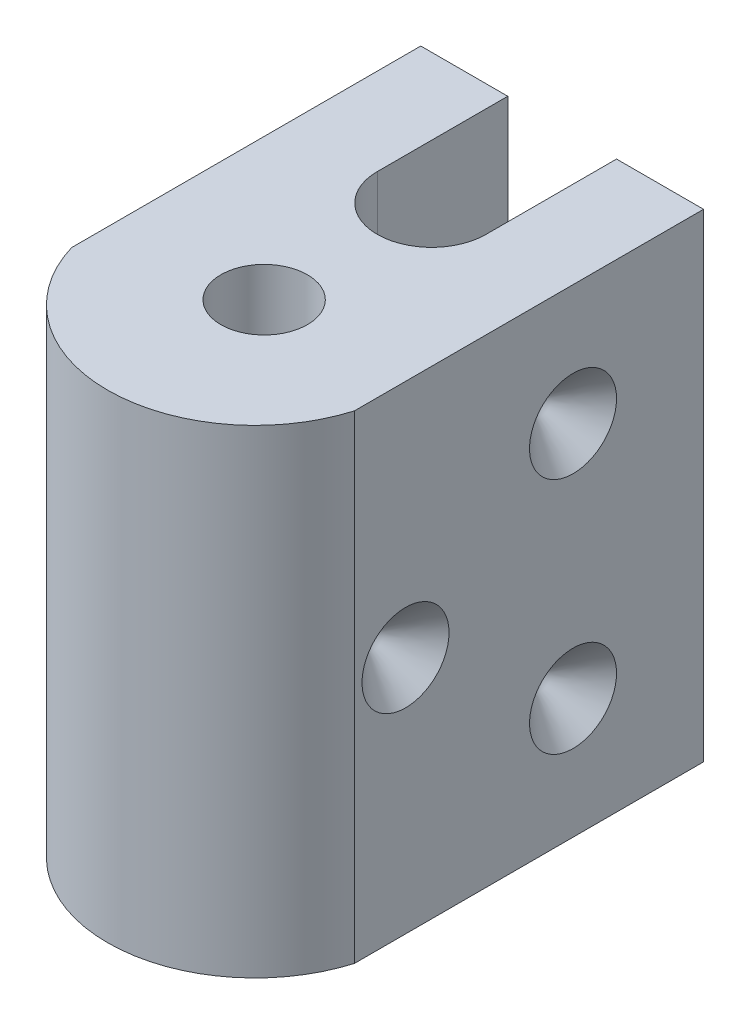
ISO-10303-21;
HEADER;
FILE_DESCRIPTION(('STEP AP214'),'2;1');
FILE_NAME('part.step','',(''),(''),'','','');
FILE_SCHEMA(('AUTOMOTIVE_DESIGN { 1 0 10303 214 1 1 1 1 }'));
ENDSEC;
DATA;
#1=APPLICATION_CONTEXT('core data for automotive mechanical design processes');
#2=APPLICATION_PROTOCOL_DEFINITION('international standard','automotive_design',2000,#1);
#3=PRODUCT_CONTEXT('',#1,'mechanical');
#4=PRODUCT('Part','Part','',(#3));
#5=PRODUCT_RELATED_PRODUCT_CATEGORY('part','',(#4));
#6=PRODUCT_DEFINITION_FORMATION('','',#4);
#7=PRODUCT_DEFINITION_CONTEXT('part definition',#1,'design');
#8=PRODUCT_DEFINITION('design','',#6,#7);
#9=PRODUCT_DEFINITION_SHAPE('','',#8);
#10=(LENGTH_UNIT() NAMED_UNIT(*) SI_UNIT(.MILLI.,.METRE.));
#11=(NAMED_UNIT(*) PLANE_ANGLE_UNIT() SI_UNIT($,.RADIAN.));
#12=(NAMED_UNIT(*) SI_UNIT($,.STERADIAN.) SOLID_ANGLE_UNIT());
#13=UNCERTAINTY_MEASURE_WITH_UNIT(LENGTH_MEASURE(1.E-05),#10,'distance_accuracy_value','');
#14=(GEOMETRIC_REPRESENTATION_CONTEXT(3) GLOBAL_UNCERTAINTY_ASSIGNED_CONTEXT((#13)) GLOBAL_UNIT_ASSIGNED_CONTEXT((#10,
#11,#12)) REPRESENTATION_CONTEXT('',''));
#15=CARTESIAN_POINT('',(0.,0.,0.));
#16=DIRECTION('',(0.,0.,1.));
#17=DIRECTION('',(1.,0.,0.));
#18=AXIS2_PLACEMENT_3D('',#15,#16,#17);
#19=CARTESIAN_POINT('',(-14.6070197484663,22.,-5.49717868111044));
#20=DIRECTION('',(-1.,0.,0.));
#21=DIRECTION('',(0.,0.,1.));
#22=AXIS2_PLACEMENT_3D('',#19,#20,#21);
#23=PLANE('',#22);
#24=CARTESIAN_POINT('',(-14.6070197484663,11.,7.20282131888956));
#25=DIRECTION('',(1.,0.,0.));
#26=DIRECTION('',(0.,0.,-1.));
#27=AXIS2_PLACEMENT_3D('',#24,#25,#26);
#28=CIRCLE('',#27,2.);
#29=CARTESIAN_POINT('',(-14.6070197484663,11.,5.20282131888956));
#30=VERTEX_POINT('',#29);
#31=EDGE_CURVE('E135',#30,#30,#28,.T.);
#32=ORIENTED_EDGE('',*,*,#31,.F.);
#33=EDGE_LOOP('',(#32));
#34=FACE_BOUND('',#33,.T.);
#35=CARTESIAN_POINT('',(-14.6070197484663,5.5299564270152,-0.497178681110445));
#36=DIRECTION('',(1.,0.,0.));
#37=DIRECTION('',(0.,0.,-1.));
#38=AXIS2_PLACEMENT_3D('',#35,#36,#37);
#39=CIRCLE('',#38,2.);
#40=CARTESIAN_POINT('',(-14.6070197484663,5.5299564270152,-2.49717868111044));
#41=VERTEX_POINT('',#40);
#42=EDGE_CURVE('E143',#41,#41,#39,.F.);
#43=ORIENTED_EDGE('',*,*,#42,.T.);
#44=EDGE_LOOP('',(#43));
#45=FACE_BOUND('',#44,.T.);
#46=DIRECTION('',(0.,0.,-1.));
#47=VECTOR('',#46,1.);
#48=CARTESIAN_POINT('',(-14.6070197484663,0.,-5.49717868111044));
#49=LINE('',#48,#47);
#50=CARTESIAN_POINT('',(-14.6070197484663,0.,9.55535975360698));
#51=VERTEX_POINT('',#50);
#52=CARTESIAN_POINT('',(-14.6070197484663,0.,-6.49717868111044));
#53=VERTEX_POINT('',#52);
#54=EDGE_CURVE('E213',#51,#53,#49,.T.);
#55=ORIENTED_EDGE('',*,*,#54,.T.);
#56=DIRECTION('',(0.,-1.,0.));
#57=VECTOR('',#56,1.);
#58=CARTESIAN_POINT('',(-14.6070197484663,22.,-6.49717868111044));
#59=LINE('',#58,#57);
#60=CARTESIAN_POINT('',(-14.6070197484663,22.,-6.49717868111044));
#61=VERTEX_POINT('',#60);
#62=EDGE_CURVE('E160',#61,#53,#59,.T.);
#63=ORIENTED_EDGE('',*,*,#62,.F.);
#64=DIRECTION('',(0.,0.,-1.));
#65=VECTOR('',#64,1.);
#66=CARTESIAN_POINT('',(-14.6070197484663,22.,-5.49717868111044));
#67=LINE('',#66,#65);
#68=CARTESIAN_POINT('',(-14.6070197484663,22.,9.55535975360698));
#69=VERTEX_POINT('',#68);
#70=EDGE_CURVE('E196',#69,#61,#67,.T.);
#71=ORIENTED_EDGE('',*,*,#70,.F.);
#72=DIRECTION('',(0.,-1.,0.));
#73=VECTOR('',#72,1.);
#74=CARTESIAN_POINT('',(-14.6070197484663,22.,9.55535975360698));
#75=LINE('',#74,#73);
#76=EDGE_CURVE('E220',#69,#51,#75,.T.);
#77=ORIENTED_EDGE('',*,*,#76,.T.);
#78=EDGE_LOOP('',(#55,#63,#71,#77));
#79=FACE_BOUND('',#78,.T.);
#80=CARTESIAN_POINT('',(-14.6070197484663,16.4700435729848,-0.49717868111044));
#81=DIRECTION('',(1.,0.,0.));
#82=DIRECTION('',(0.,0.,-1.));
#83=AXIS2_PLACEMENT_3D('',#80,#81,#82);
#84=CIRCLE('',#83,2.);
#85=CARTESIAN_POINT('',(-14.6070197484663,16.4700435729848,-2.49717868111044));
#86=VERTEX_POINT('',#85);
#87=EDGE_CURVE('E131',#86,#86,#84,.T.);
#88=ORIENTED_EDGE('',*,*,#87,.F.);
#89=EDGE_LOOP('',(#88));
#90=FACE_BOUND('',#89,.T.);
#91=ADVANCED_FACE('F41',(#34,#45,#79,#90),#23,.F.);
#92=CARTESIAN_POINT('',(-21.1070197484663,22.,-0.497178681110441));
#93=DIRECTION('',(0.,1.,0.));
#94=DIRECTION('',(0.,0.,1.));
#95=AXIS2_PLACEMENT_3D('',#92,#93,#94);
#96=PLANE('',#95);
#97=CARTESIAN_POINT('',(-21.1070197484663,22.,-0.497178681110441));
#98=DIRECTION('',(0.,-1.,0.));
#99=DIRECTION('',(0.,0.,1.));
#100=AXIS2_PLACEMENT_3D('',#97,#98,#99);
#101=CIRCLE('',#100,2.5);
#102=CARTESIAN_POINT('',(-18.6070197484663,22.,-0.497178681110441));
#103=VERTEX_POINT('',#102);
#104=CARTESIAN_POINT('',(-23.6070197484663,22.,-0.497178681110441));
#105=VERTEX_POINT('',#104);
#106=EDGE_CURVE('E185',#103,#105,#101,.T.);
#107=ORIENTED_EDGE('',*,*,#106,.T.);
#108=DIRECTION('',(0.,0.,-1.));
#109=VECTOR('',#108,1.);
#110=CARTESIAN_POINT('',(-23.6070197484663,22.,-0.497178681110441));
#111=LINE('',#110,#109);
#112=CARTESIAN_POINT('',(-23.6070197484663,22.,-6.49717868111044));
#113=VERTEX_POINT('',#112);
#114=EDGE_CURVE('E92',#105,#113,#111,.T.);
#115=ORIENTED_EDGE('',*,*,#114,.T.);
#116=DIRECTION('',(1.,0.,0.));
#117=VECTOR('',#116,1.);
#118=CARTESIAN_POINT('',(-23.6070197484663,22.,-6.49717868111044));
#119=LINE('',#118,#117);
#120=CARTESIAN_POINT('',(-27.6070197484663,22.,-6.49717868111044));
#121=VERTEX_POINT('',#120);
#122=EDGE_CURVE('E156',#121,#113,#119,.T.);
#123=ORIENTED_EDGE('',*,*,#122,.F.);
#124=DIRECTION('',(0.,0.,1.));
#125=VECTOR('',#124,1.);
#126=CARTESIAN_POINT('',(-27.6070197484663,22.,-5.49717868111044));
#127=LINE('',#126,#125);
#128=CARTESIAN_POINT('',(-27.6070197484663,22.,9.55535975360698));
#129=VERTEX_POINT('',#128);
#130=EDGE_CURVE('E190',#121,#129,#127,.T.);
#131=ORIENTED_EDGE('',*,*,#130,.T.);
#132=CARTESIAN_POINT('',(-21.1070197484663,22.,7.62019041497303));
#133=DIRECTION('',(0.,1.,0.));
#134=DIRECTION('',(0.,0.,-1.));
#135=AXIS2_PLACEMENT_3D('',#132,#133,#134);
#136=CIRCLE('',#135,6.78195254843242);
#137=EDGE_CURVE('E193',#129,#69,#136,.T.);
#138=ORIENTED_EDGE('',*,*,#137,.T.);
#139=ORIENTED_EDGE('',*,*,#70,.T.);
#140=DIRECTION('',(1.,0.,0.));
#141=VECTOR('',#140,1.);
#142=CARTESIAN_POINT('',(-14.6070197484663,22.,-6.49717868111044));
#143=LINE('',#142,#141);
#144=CARTESIAN_POINT('',(-18.6070197484663,22.,-6.49717868111044));
#145=VERTEX_POINT('',#144);
#146=EDGE_CURVE('E172',#145,#61,#143,.T.);
#147=ORIENTED_EDGE('',*,*,#146,.F.);
#148=DIRECTION('',(0.,0.,1.));
#149=VECTOR('',#148,1.);
#150=CARTESIAN_POINT('',(-18.6070197484663,22.,-0.497178681110441));
#151=LINE('',#150,#149);
#152=EDGE_CURVE('E59',#145,#103,#151,.T.);
#153=ORIENTED_EDGE('',*,*,#152,.T.);
#154=EDGE_LOOP('',(#107,#115,#123,#131,#138,#139,#147,#153));
#155=FACE_BOUND('',#154,.T.);
#156=CARTESIAN_POINT('',(-21.1070197484663,22.,7.20282131888956));
#157=DIRECTION('',(0.,1.,0.));
#158=DIRECTION('',(0.,0.,1.));
#159=AXIS2_PLACEMENT_3D('',#156,#157,#158);
#160=CIRCLE('',#159,1.98968489007795);
#161=CARTESIAN_POINT('',(-21.1070197484663,22.,9.1925062089675));
#162=VERTEX_POINT('',#161);
#163=EDGE_CURVE('E177',#162,#162,#160,.T.);
#164=ORIENTED_EDGE('',*,*,#163,.F.);
#165=EDGE_LOOP('',(#164));
#166=FACE_BOUND('',#165,.T.);
#167=ADVANCED_FACE('F237',(#155,#166),#96,.T.);
#168=CARTESIAN_POINT('',(-21.1070197484663,0.,-0.497178681110441));
#169=DIRECTION('',(0.,1.,0.));
#170=DIRECTION('',(0.,0.,1.));
#171=AXIS2_PLACEMENT_3D('',#168,#169,#170);
#172=PLANE('',#171);
#173=CARTESIAN_POINT('',(-21.1070197484663,0.,-0.497178681110441));
#174=DIRECTION('',(0.,-1.,0.));
#175=DIRECTION('',(0.,0.,1.));
#176=AXIS2_PLACEMENT_3D('',#173,#174,#175);
#177=CIRCLE('',#176,2.5);
#178=CARTESIAN_POINT('',(-18.6070197484663,0.,-0.497178681110441));
#179=VERTEX_POINT('',#178);
#180=CARTESIAN_POINT('',(-23.6070197484663,0.,-0.497178681110441));
#181=VERTEX_POINT('',#180);
#182=EDGE_CURVE('E181',#179,#181,#177,.T.);
#183=ORIENTED_EDGE('',*,*,#182,.F.);
#184=DIRECTION('',(0.,0.,1.));
#185=VECTOR('',#184,1.);
#186=CARTESIAN_POINT('',(-18.6070197484663,0.,-0.497178681110441));
#187=LINE('',#186,#185);
#188=CARTESIAN_POINT('',(-18.6070197484663,0.,-6.49717868111044));
#189=VERTEX_POINT('',#188);
#190=EDGE_CURVE('E85',#189,#179,#187,.T.);
#191=ORIENTED_EDGE('',*,*,#190,.F.);
#192=DIRECTION('',(-1.,0.,0.));
#193=VECTOR('',#192,1.);
#194=CARTESIAN_POINT('',(-14.6070197484663,0.,-6.49717868111044));
#195=LINE('',#194,#193);
#196=EDGE_CURVE('E164',#53,#189,#195,.T.);
#197=ORIENTED_EDGE('',*,*,#196,.F.);
#198=ORIENTED_EDGE('',*,*,#54,.F.);
#199=CARTESIAN_POINT('',(-21.1070197484663,0.,7.62019041497303));
#200=DIRECTION('',(0.,1.,0.));
#201=DIRECTION('',(0.,0.,-1.));
#202=AXIS2_PLACEMENT_3D('',#199,#200,#201);
#203=CIRCLE('',#202,6.78195254843242);
#204=CARTESIAN_POINT('',(-27.6070197484663,0.,9.55535975360698));
#205=VERTEX_POINT('',#204);
#206=EDGE_CURVE('E78',#205,#51,#203,.T.);
#207=ORIENTED_EDGE('',*,*,#206,.F.);
#208=DIRECTION('',(0.,0.,1.));
#209=VECTOR('',#208,1.);
#210=CARTESIAN_POINT('',(-27.6070197484663,0.,-5.49717868111044));
#211=LINE('',#210,#209);
#212=CARTESIAN_POINT('',(-27.6070197484663,0.,-6.49717868111044));
#213=VERTEX_POINT('',#212);
#214=EDGE_CURVE('E208',#213,#205,#211,.T.);
#215=ORIENTED_EDGE('',*,*,#214,.F.);
#216=DIRECTION('',(-1.,0.,0.));
#217=VECTOR('',#216,1.);
#218=CARTESIAN_POINT('',(-23.6070197484663,0.,-6.49717868111044));
#219=LINE('',#218,#217);
#220=CARTESIAN_POINT('',(-23.6070197484663,0.,-6.49717868111044));
#221=VERTEX_POINT('',#220);
#222=EDGE_CURVE('E140',#221,#213,#219,.T.);
#223=ORIENTED_EDGE('',*,*,#222,.F.);
#224=DIRECTION('',(0.,0.,-1.));
#225=VECTOR('',#224,1.);
#226=CARTESIAN_POINT('',(-23.6070197484663,0.,-0.497178681110441));
#227=LINE('',#226,#225);
#228=EDGE_CURVE('E205',#181,#221,#227,.T.);
#229=ORIENTED_EDGE('',*,*,#228,.F.);
#230=EDGE_LOOP('',(#183,#191,#197,#198,#207,#215,#223,#229));
#231=FACE_BOUND('',#230,.T.);
#232=CARTESIAN_POINT('',(-21.1070197484663,0.,7.20282131888956));
#233=DIRECTION('',(0.,1.,0.));
#234=DIRECTION('',(0.,0.,1.));
#235=AXIS2_PLACEMENT_3D('',#232,#233,#234);
#236=CIRCLE('',#235,1.98968489007795);
#237=CARTESIAN_POINT('',(-21.1070197484663,0.,9.1925062089675));
#238=VERTEX_POINT('',#237);
#239=EDGE_CURVE('E176',#238,#238,#236,.T.);
#240=ORIENTED_EDGE('',*,*,#239,.T.);
#241=EDGE_LOOP('',(#240));
#242=FACE_BOUND('',#241,.T.);
#243=ADVANCED_FACE('F230',(#231,#242),#172,.F.);
#244=CARTESIAN_POINT('',(-21.1070197484663,22.,-0.497178681110441));
#245=DIRECTION('',(0.,-1.,0.));
#246=DIRECTION('',(0.,0.,-1.));
#247=AXIS2_PLACEMENT_3D('',#244,#245,#246);
#248=CYLINDRICAL_SURFACE('',#247,2.5);
#249=ORIENTED_EDGE('',*,*,#182,.T.);
#250=DIRECTION('',(0.,-1.,0.));
#251=VECTOR('',#250,1.);
#252=CARTESIAN_POINT('',(-23.6070197484663,22.,-0.497178681110441));
#253=LINE('',#252,#251);
#254=EDGE_CURVE('E11',#105,#181,#253,.T.);
#255=ORIENTED_EDGE('',*,*,#254,.F.);
#256=ORIENTED_EDGE('',*,*,#106,.F.);
#257=DIRECTION('',(0.,-1.,0.));
#258=VECTOR('',#257,1.);
#259=CARTESIAN_POINT('',(-18.6070197484663,22.,-0.497178681110441));
#260=LINE('',#259,#258);
#261=EDGE_CURVE('E201',#103,#179,#260,.T.);
#262=ORIENTED_EDGE('',*,*,#261,.T.);
#263=EDGE_LOOP('',(#249,#255,#256,#262));
#264=FACE_BOUND('',#263,.T.);
#265=ADVANCED_FACE('F43',(#264),#248,.F.);
#266=CARTESIAN_POINT('',(-23.6070197484663,22.,-0.497178681110441));
#267=DIRECTION('',(-1.,0.,0.));
#268=DIRECTION('',(0.,0.,1.));
#269=AXIS2_PLACEMENT_3D('',#266,#267,#268);
#270=PLANE('',#269);
#271=ORIENTED_EDGE('',*,*,#228,.T.);
#272=DIRECTION('',(0.,-1.,0.));
#273=VECTOR('',#272,1.);
#274=CARTESIAN_POINT('',(-23.6070197484663,22.,-6.49717868111044));
#275=LINE('',#274,#273);
#276=EDGE_CURVE('E134',#113,#221,#275,.T.);
#277=ORIENTED_EDGE('',*,*,#276,.F.);
#278=ORIENTED_EDGE('',*,*,#114,.F.);
#279=ORIENTED_EDGE('',*,*,#254,.T.);
#280=EDGE_LOOP('',(#271,#277,#278,#279));
#281=FACE_BOUND('',#280,.T.);
#282=ADVANCED_FACE('F249',(#281),#270,.F.);
#283=CARTESIAN_POINT('',(-27.6070197484663,22.,-5.49717868111044));
#284=DIRECTION('',(1.,0.,0.));
#285=DIRECTION('',(0.,0.,-1.));
#286=AXIS2_PLACEMENT_3D('',#283,#284,#285);
#287=PLANE('',#286);
#288=ORIENTED_EDGE('',*,*,#214,.T.);
#289=DIRECTION('',(0.,-1.,0.));
#290=VECTOR('',#289,1.);
#291=CARTESIAN_POINT('',(-27.6070197484663,22.,9.55535975360698));
#292=LINE('',#291,#290);
#293=EDGE_CURVE('E51',#129,#205,#292,.T.);
#294=ORIENTED_EDGE('',*,*,#293,.F.);
#295=ORIENTED_EDGE('',*,*,#130,.F.);
#296=DIRECTION('',(0.,1.,0.));
#297=VECTOR('',#296,1.);
#298=CARTESIAN_POINT('',(-27.6070197484663,22.,-6.49717868111044));
#299=LINE('',#298,#297);
#300=EDGE_CURVE('E152',#213,#121,#299,.T.);
#301=ORIENTED_EDGE('',*,*,#300,.F.);
#302=EDGE_LOOP('',(#288,#294,#295,#301));
#303=FACE_BOUND('',#302,.T.);
#304=ADVANCED_FACE('F250',(#303),#287,.F.);
#305=CARTESIAN_POINT('',(-21.1070197484663,22.,7.62019041497303));
#306=DIRECTION('',(0.,-1.,0.));
#307=DIRECTION('',(0.,0.,-1.));
#308=AXIS2_PLACEMENT_3D('',#305,#306,#307);
#309=CYLINDRICAL_SURFACE('',#308,6.78195254843242);
#310=ORIENTED_EDGE('',*,*,#206,.T.);
#311=ORIENTED_EDGE('',*,*,#76,.F.);
#312=ORIENTED_EDGE('',*,*,#137,.F.);
#313=ORIENTED_EDGE('',*,*,#293,.T.);
#314=EDGE_LOOP('',(#310,#311,#312,#313));
#315=FACE_BOUND('',#314,.T.);
#316=ADVANCED_FACE('F225',(#315),#309,.T.);
#317=CARTESIAN_POINT('',(-18.6070197484663,22.,-0.497178681110441));
#318=DIRECTION('',(1.,0.,0.));
#319=DIRECTION('',(0.,0.,-1.));
#320=AXIS2_PLACEMENT_3D('',#317,#318,#319);
#321=PLANE('',#320);
#322=ORIENTED_EDGE('',*,*,#190,.T.);
#323=ORIENTED_EDGE('',*,*,#261,.F.);
#324=ORIENTED_EDGE('',*,*,#152,.F.);
#325=DIRECTION('',(0.,1.,0.));
#326=VECTOR('',#325,1.);
#327=CARTESIAN_POINT('',(-18.6070197484663,22.,-6.49717868111044));
#328=LINE('',#327,#326);
#329=EDGE_CURVE('E168',#189,#145,#328,.T.);
#330=ORIENTED_EDGE('',*,*,#329,.F.);
#331=EDGE_LOOP('',(#322,#323,#324,#330));
#332=FACE_BOUND('',#331,.T.);
#333=ADVANCED_FACE('F241',(#332),#321,.F.);
#334=CARTESIAN_POINT('',(-21.1070197484663,22.,7.20282131888956));
#335=DIRECTION('',(0.,-1.,0.));
#336=DIRECTION('',(0.,0.,-1.));
#337=AXIS2_PLACEMENT_3D('',#334,#335,#336);
#338=CYLINDRICAL_SURFACE('',#337,1.98968489007795);
#339=ORIENTED_EDGE('',*,*,#163,.T.);
#340=EDGE_LOOP('',(#339));
#341=FACE_BOUND('',#340,.T.);
#342=ORIENTED_EDGE('',*,*,#239,.F.);
#343=EDGE_LOOP('',(#342));
#344=FACE_BOUND('',#343,.T.);
#345=ADVANCED_FACE('F270',(#341,#344),#338,.F.);
#346=CARTESIAN_POINT('',(0.,0.,-6.49717868111044));
#347=DIRECTION('',(0.,0.,-1.));
#348=DIRECTION('',(-1.,0.,0.));
#349=AXIS2_PLACEMENT_3D('',#346,#347,#348);
#350=PLANE('',#349);
#351=ORIENTED_EDGE('',*,*,#62,.T.);
#352=ORIENTED_EDGE('',*,*,#196,.T.);
#353=ORIENTED_EDGE('',*,*,#329,.T.);
#354=ORIENTED_EDGE('',*,*,#146,.T.);
#355=EDGE_LOOP('',(#351,#352,#353,#354));
#356=FACE_BOUND('',#355,.T.);
#357=ADVANCED_FACE('F240',(#356),#350,.T.);
#358=CARTESIAN_POINT('',(0.,0.,-6.49717868111044));
#359=DIRECTION('',(0.,0.,-1.));
#360=DIRECTION('',(-1.,0.,0.));
#361=AXIS2_PLACEMENT_3D('',#358,#359,#360);
#362=PLANE('',#361);
#363=ORIENTED_EDGE('',*,*,#276,.T.);
#364=ORIENTED_EDGE('',*,*,#222,.T.);
#365=ORIENTED_EDGE('',*,*,#300,.T.);
#366=ORIENTED_EDGE('',*,*,#122,.T.);
#367=EDGE_LOOP('',(#363,#364,#365,#366));
#368=FACE_BOUND('',#367,.T.);
#369=ADVANCED_FACE('F247',(#368),#362,.T.);
#370=CARTESIAN_POINT('',(-14.6070197484663,5.5299564270152,-0.497178681110445));
#371=DIRECTION('',(1.,0.,0.));
#372=DIRECTION('',(0.,0.,-1.));
#373=AXIS2_PLACEMENT_3D('',#370,#371,#372);
#374=CONICAL_SURFACE('',#373,2.,0.78539816339745);
#375=CARTESIAN_POINT('',(-16.6070197484663,5.5299564270152,-0.497178681110445));
#376=VERTEX_POINT('',#375);
#377=VERTEX_LOOP('',#376);
#378=FACE_BOUND('',#377,.T.);
#379=ORIENTED_EDGE('',*,*,#42,.F.);
#380=EDGE_LOOP('',(#379));
#381=FACE_BOUND('',#380,.T.);
#382=ADVANCED_FACE('F280',(#378,#381),#374,.F.);
#383=CARTESIAN_POINT('',(-14.6070197484663,11.,7.20282131888956));
#384=DIRECTION('',(1.,0.,0.));
#385=DIRECTION('',(0.,0.,-1.));
#386=AXIS2_PLACEMENT_3D('',#383,#384,#385);
#387=CONICAL_SURFACE('',#386,2.,0.78539816339745);
#388=CARTESIAN_POINT('',(-16.6070197484663,11.,7.20282131888956));
#389=VERTEX_POINT('',#388);
#390=VERTEX_LOOP('',#389);
#391=FACE_BOUND('',#390,.T.);
#392=ORIENTED_EDGE('',*,*,#31,.T.);
#393=EDGE_LOOP('',(#392));
#394=FACE_BOUND('',#393,.T.);
#395=ADVANCED_FACE('F127',(#391,#394),#387,.F.);
#396=CARTESIAN_POINT('',(-14.6070197484663,16.4700435729848,-0.49717868111044));
#397=DIRECTION('',(1.,0.,0.));
#398=DIRECTION('',(0.,0.,-1.));
#399=AXIS2_PLACEMENT_3D('',#396,#397,#398);
#400=CONICAL_SURFACE('',#399,2.,0.78539816339745);
#401=CARTESIAN_POINT('',(-16.6070197484663,16.4700435729848,-0.49717868111044));
#402=VERTEX_POINT('',#401);
#403=VERTEX_LOOP('',#402);
#404=FACE_BOUND('',#403,.T.);
#405=ORIENTED_EDGE('',*,*,#87,.T.);
#406=EDGE_LOOP('',(#405));
#407=FACE_BOUND('',#406,.T.);
#408=ADVANCED_FACE('F124',(#404,#407),#400,.F.);
#409=CLOSED_SHELL('',(#91,#167,#243,#265,#282,#304,#316,#333,#345,#357,#369,#382,#395,#408));
#410=MANIFOLD_SOLID_BREP('B2',#409);
#411=ADVANCED_BREP_SHAPE_REPRESENTATION('',(#18,#410),#14);
#412=SHAPE_DEFINITION_REPRESENTATION(#9,#411);
ENDSEC;
END-ISO-10303-21;
